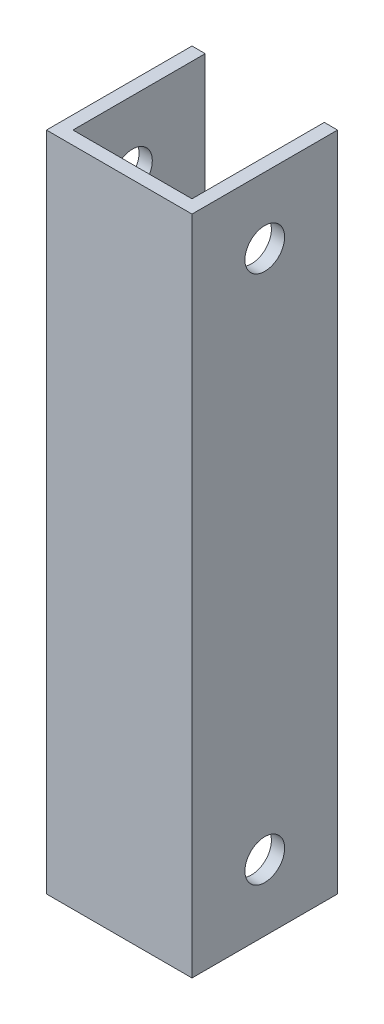
ISO-10303-21;
HEADER;
FILE_DESCRIPTION(('STEP AP214'),'2;1');
FILE_NAME('part.step','',(''),(''),'','','');
FILE_SCHEMA(('AUTOMOTIVE_DESIGN { 1 0 10303 214 1 1 1 1 }'));
ENDSEC;
DATA;
#1=APPLICATION_CONTEXT('core data for automotive mechanical design processes');
#2=APPLICATION_PROTOCOL_DEFINITION('international standard','automotive_design',2000,#1);
#3=PRODUCT_CONTEXT('',#1,'mechanical');
#4=PRODUCT('Part','Part','',(#3));
#5=PRODUCT_RELATED_PRODUCT_CATEGORY('part','',(#4));
#6=PRODUCT_DEFINITION_FORMATION('','',#4);
#7=PRODUCT_DEFINITION_CONTEXT('part definition',#1,'design');
#8=PRODUCT_DEFINITION('design','',#6,#7);
#9=PRODUCT_DEFINITION_SHAPE('','',#8);
#10=(LENGTH_UNIT() NAMED_UNIT(*) SI_UNIT(.MILLI.,.METRE.));
#11=(NAMED_UNIT(*) PLANE_ANGLE_UNIT() SI_UNIT($,.RADIAN.));
#12=(NAMED_UNIT(*) SI_UNIT($,.STERADIAN.) SOLID_ANGLE_UNIT());
#13=UNCERTAINTY_MEASURE_WITH_UNIT(LENGTH_MEASURE(1.E-05),#10,'distance_accuracy_value','');
#14=(GEOMETRIC_REPRESENTATION_CONTEXT(3) GLOBAL_UNCERTAINTY_ASSIGNED_CONTEXT((#13)) GLOBAL_UNIT_ASSIGNED_CONTEXT((#10,
#11,#12)) REPRESENTATION_CONTEXT('',''));
#15=CARTESIAN_POINT('',(0.,0.,0.));
#16=DIRECTION('',(0.,0.,1.));
#17=DIRECTION('',(1.,0.,0.));
#18=AXIS2_PLACEMENT_3D('',#15,#16,#17);
#19=CARTESIAN_POINT('',(11.,100.,-11.));
#20=DIRECTION('',(-1.,0.,0.));
#21=DIRECTION('',(0.,0.,1.));
#22=AXIS2_PLACEMENT_3D('',#19,#20,#21);
#23=PLANE('',#22);
#24=CARTESIAN_POINT('',(11.,90.,0.));
#25=DIRECTION('',(1.,0.,0.));
#26=DIRECTION('',(0.,0.,-1.));
#27=AXIS2_PLACEMENT_3D('',#24,#25,#26);
#28=CIRCLE('',#27,3.);
#29=CARTESIAN_POINT('',(11.,90.,-3.));
#30=VERTEX_POINT('',#29);
#31=EDGE_CURVE('E228',#30,#30,#28,.T.);
#32=ORIENTED_EDGE('',*,*,#31,.F.);
#33=EDGE_LOOP('',(#32));
#34=FACE_BOUND('',#33,.T.);
#35=CARTESIAN_POINT('',(11.,10.,0.));
#36=DIRECTION('',(1.,0.,0.));
#37=DIRECTION('',(0.,0.,-1.));
#38=AXIS2_PLACEMENT_3D('',#35,#36,#37);
#39=CIRCLE('',#38,3.);
#40=CARTESIAN_POINT('',(11.,10.,-3.));
#41=VERTEX_POINT('',#40);
#42=EDGE_CURVE('E215',#41,#41,#39,.T.);
#43=ORIENTED_EDGE('',*,*,#42,.F.);
#44=EDGE_LOOP('',(#43));
#45=FACE_BOUND('',#44,.T.);
#46=DIRECTION('',(0.,0.,-1.));
#47=VECTOR('',#46,1.);
#48=CARTESIAN_POINT('',(11.,0.,-11.));
#49=LINE('',#48,#47);
#50=CARTESIAN_POINT('',(11.,0.,11.));
#51=VERTEX_POINT('',#50);
#52=CARTESIAN_POINT('',(11.,0.,-11.));
#53=VERTEX_POINT('',#52);
#54=EDGE_CURVE('E140',#51,#53,#49,.T.);
#55=ORIENTED_EDGE('',*,*,#54,.T.);
#56=DIRECTION('',(0.,-1.,0.));
#57=VECTOR('',#56,1.);
#58=CARTESIAN_POINT('',(11.,100.,-11.));
#59=LINE('',#58,#57);
#60=CARTESIAN_POINT('',(11.,100.,-11.));
#61=VERTEX_POINT('',#60);
#62=EDGE_CURVE('E11',#61,#53,#59,.T.);
#63=ORIENTED_EDGE('',*,*,#62,.F.);
#64=DIRECTION('',(0.,0.,-1.));
#65=VECTOR('',#64,1.);
#66=CARTESIAN_POINT('',(11.,100.,-11.));
#67=LINE('',#66,#65);
#68=CARTESIAN_POINT('',(11.,100.,11.));
#69=VERTEX_POINT('',#68);
#70=EDGE_CURVE('E163',#69,#61,#67,.T.);
#71=ORIENTED_EDGE('',*,*,#70,.F.);
#72=DIRECTION('',(0.,-1.,0.));
#73=VECTOR('',#72,1.);
#74=CARTESIAN_POINT('',(11.,100.,11.));
#75=LINE('',#74,#73);
#76=EDGE_CURVE('E136',#69,#51,#75,.T.);
#77=ORIENTED_EDGE('',*,*,#76,.T.);
#78=EDGE_LOOP('',(#55,#63,#71,#77));
#79=FACE_BOUND('',#78,.T.);
#80=ADVANCED_FACE('F38',(#34,#45,#79),#23,.F.);
#81=CARTESIAN_POINT('',(9.,100.,-11.));
#82=DIRECTION('',(0.,0.,1.));
#83=DIRECTION('',(1.,0.,0.));
#84=AXIS2_PLACEMENT_3D('',#81,#82,#83);
#85=PLANE('',#84);
#86=DIRECTION('',(-1.,0.,0.));
#87=VECTOR('',#86,1.);
#88=CARTESIAN_POINT('',(9.,0.,-11.));
#89=LINE('',#88,#87);
#90=CARTESIAN_POINT('',(9.,0.,-11.));
#91=VERTEX_POINT('',#90);
#92=EDGE_CURVE('E144',#53,#91,#89,.T.);
#93=ORIENTED_EDGE('',*,*,#92,.T.);
#94=DIRECTION('',(0.,-1.,0.));
#95=VECTOR('',#94,1.);
#96=CARTESIAN_POINT('',(9.,100.,-11.));
#97=LINE('',#96,#95);
#98=CARTESIAN_POINT('',(9.,100.,-11.));
#99=VERTEX_POINT('',#98);
#100=EDGE_CURVE('E48',#99,#91,#97,.T.);
#101=ORIENTED_EDGE('',*,*,#100,.F.);
#102=DIRECTION('',(-1.,0.,0.));
#103=VECTOR('',#102,1.);
#104=CARTESIAN_POINT('',(9.,100.,-11.));
#105=LINE('',#104,#103);
#106=EDGE_CURVE('E99',#61,#99,#105,.T.);
#107=ORIENTED_EDGE('',*,*,#106,.F.);
#108=ORIENTED_EDGE('',*,*,#62,.T.);
#109=EDGE_LOOP('',(#93,#101,#107,#108));
#110=FACE_BOUND('',#109,.T.);
#111=ADVANCED_FACE('F264',(#110),#85,.F.);
#112=CARTESIAN_POINT('',(9.,100.,9.));
#113=DIRECTION('',(1.,0.,0.));
#114=DIRECTION('',(0.,0.,-1.));
#115=AXIS2_PLACEMENT_3D('',#112,#113,#114);
#116=PLANE('',#115);
#117=CARTESIAN_POINT('',(9.,90.,0.));
#118=DIRECTION('',(1.,0.,0.));
#119=DIRECTION('',(0.,0.,-1.));
#120=AXIS2_PLACEMENT_3D('',#117,#118,#119);
#121=CIRCLE('',#120,3.);
#122=CARTESIAN_POINT('',(9.,90.,-3.));
#123=VERTEX_POINT('',#122);
#124=EDGE_CURVE('E219',#123,#123,#121,.T.);
#125=ORIENTED_EDGE('',*,*,#124,.T.);
#126=EDGE_LOOP('',(#125));
#127=FACE_BOUND('',#126,.T.);
#128=CARTESIAN_POINT('',(8.99999999999999,10.,0.));
#129=DIRECTION('',(1.,0.,0.));
#130=DIRECTION('',(0.,0.,-1.));
#131=AXIS2_PLACEMENT_3D('',#128,#129,#130);
#132=CIRCLE('',#131,3.);
#133=CARTESIAN_POINT('',(8.99999999999999,10.,-3.));
#134=VERTEX_POINT('',#133);
#135=EDGE_CURVE('E145',#134,#134,#132,.T.);
#136=ORIENTED_EDGE('',*,*,#135,.T.);
#137=EDGE_LOOP('',(#136));
#138=FACE_BOUND('',#137,.T.);
#139=DIRECTION('',(0.,0.,1.));
#140=VECTOR('',#139,1.);
#141=CARTESIAN_POINT('',(9.,0.,9.));
#142=LINE('',#141,#140);
#143=CARTESIAN_POINT('',(9.,0.,9.));
#144=VERTEX_POINT('',#143);
#145=EDGE_CURVE('E148',#91,#144,#142,.T.);
#146=ORIENTED_EDGE('',*,*,#145,.T.);
#147=DIRECTION('',(0.,-1.,0.));
#148=VECTOR('',#147,1.);
#149=CARTESIAN_POINT('',(9.,100.,9.));
#150=LINE('',#149,#148);
#151=CARTESIAN_POINT('',(9.,100.,9.));
#152=VERTEX_POINT('',#151);
#153=EDGE_CURVE('E174',#152,#144,#150,.T.);
#154=ORIENTED_EDGE('',*,*,#153,.F.);
#155=DIRECTION('',(0.,0.,1.));
#156=VECTOR('',#155,1.);
#157=CARTESIAN_POINT('',(9.,100.,9.));
#158=LINE('',#157,#156);
#159=EDGE_CURVE('E185',#99,#152,#158,.T.);
#160=ORIENTED_EDGE('',*,*,#159,.F.);
#161=ORIENTED_EDGE('',*,*,#100,.T.);
#162=EDGE_LOOP('',(#146,#154,#160,#161));
#163=FACE_BOUND('',#162,.T.);
#164=ADVANCED_FACE('F183',(#127,#138,#163),#116,.F.);
#165=CARTESIAN_POINT('',(-9.,100.,9.));
#166=DIRECTION('',(0.,0.,1.));
#167=DIRECTION('',(1.,0.,0.));
#168=AXIS2_PLACEMENT_3D('',#165,#166,#167);
#169=PLANE('',#168);
#170=DIRECTION('',(-1.,0.,0.));
#171=VECTOR('',#170,1.);
#172=CARTESIAN_POINT('',(-9.,0.,9.));
#173=LINE('',#172,#171);
#174=CARTESIAN_POINT('',(-9.,0.,9.));
#175=VERTEX_POINT('',#174);
#176=EDGE_CURVE('E151',#144,#175,#173,.T.);
#177=ORIENTED_EDGE('',*,*,#176,.T.);
#178=DIRECTION('',(0.,-1.,0.));
#179=VECTOR('',#178,1.);
#180=CARTESIAN_POINT('',(-9.,100.,9.));
#181=LINE('',#180,#179);
#182=CARTESIAN_POINT('',(-9.,100.,9.));
#183=VERTEX_POINT('',#182);
#184=EDGE_CURVE('E170',#183,#175,#181,.T.);
#185=ORIENTED_EDGE('',*,*,#184,.F.);
#186=DIRECTION('',(-1.,0.,0.));
#187=VECTOR('',#186,1.);
#188=CARTESIAN_POINT('',(-9.,100.,9.));
#189=LINE('',#188,#187);
#190=EDGE_CURVE('E198',#152,#183,#189,.T.);
#191=ORIENTED_EDGE('',*,*,#190,.F.);
#192=ORIENTED_EDGE('',*,*,#153,.T.);
#193=EDGE_LOOP('',(#177,#185,#191,#192));
#194=FACE_BOUND('',#193,.T.);
#195=ADVANCED_FACE('F193',(#194),#169,.F.);
#196=CARTESIAN_POINT('',(-9.,100.,-11.));
#197=DIRECTION('',(-1.,0.,0.));
#198=DIRECTION('',(0.,0.,1.));
#199=AXIS2_PLACEMENT_3D('',#196,#197,#198);
#200=PLANE('',#199);
#201=CARTESIAN_POINT('',(-9.,90.,0.));
#202=DIRECTION('',(-1.,0.,0.));
#203=DIRECTION('',(0.,0.,1.));
#204=AXIS2_PLACEMENT_3D('',#201,#202,#203);
#205=CIRCLE('',#204,3.);
#206=CARTESIAN_POINT('',(-9.,90.,3.));
#207=VERTEX_POINT('',#206);
#208=EDGE_CURVE('E223',#207,#207,#205,.T.);
#209=ORIENTED_EDGE('',*,*,#208,.T.);
#210=EDGE_LOOP('',(#209));
#211=FACE_BOUND('',#210,.T.);
#212=CARTESIAN_POINT('',(-8.99999999999999,10.,0.));
#213=DIRECTION('',(-1.,0.,0.));
#214=DIRECTION('',(0.,0.,1.));
#215=AXIS2_PLACEMENT_3D('',#212,#213,#214);
#216=CIRCLE('',#215,3.);
#217=CARTESIAN_POINT('',(-8.99999999999999,10.,3.));
#218=VERTEX_POINT('',#217);
#219=EDGE_CURVE('E211',#218,#218,#216,.T.);
#220=ORIENTED_EDGE('',*,*,#219,.T.);
#221=EDGE_LOOP('',(#220));
#222=FACE_BOUND('',#221,.T.);
#223=DIRECTION('',(0.,0.,-1.));
#224=VECTOR('',#223,1.);
#225=CARTESIAN_POINT('',(-9.,0.,-11.));
#226=LINE('',#225,#224);
#227=CARTESIAN_POINT('',(-9.,0.,-11.));
#228=VERTEX_POINT('',#227);
#229=EDGE_CURVE('E154',#175,#228,#226,.T.);
#230=ORIENTED_EDGE('',*,*,#229,.T.);
#231=DIRECTION('',(0.,-1.,0.));
#232=VECTOR('',#231,1.);
#233=CARTESIAN_POINT('',(-9.,100.,-11.));
#234=LINE('',#233,#232);
#235=CARTESIAN_POINT('',(-9.,100.,-11.));
#236=VERTEX_POINT('',#235);
#237=EDGE_CURVE('E129',#236,#228,#234,.T.);
#238=ORIENTED_EDGE('',*,*,#237,.F.);
#239=DIRECTION('',(0.,0.,-1.));
#240=VECTOR('',#239,1.);
#241=CARTESIAN_POINT('',(-9.,100.,-11.));
#242=LINE('',#241,#240);
#243=EDGE_CURVE('E118',#183,#236,#242,.T.);
#244=ORIENTED_EDGE('',*,*,#243,.F.);
#245=ORIENTED_EDGE('',*,*,#184,.T.);
#246=EDGE_LOOP('',(#230,#238,#244,#245));
#247=FACE_BOUND('',#246,.T.);
#248=ADVANCED_FACE('F196',(#211,#222,#247),#200,.F.);
#249=CARTESIAN_POINT('',(-11.,100.,-11.));
#250=DIRECTION('',(0.,0.,1.));
#251=DIRECTION('',(1.,0.,0.));
#252=AXIS2_PLACEMENT_3D('',#249,#250,#251);
#253=PLANE('',#252);
#254=DIRECTION('',(-1.,0.,0.));
#255=VECTOR('',#254,1.);
#256=CARTESIAN_POINT('',(-11.,0.,-11.));
#257=LINE('',#256,#255);
#258=CARTESIAN_POINT('',(-11.,0.,-11.));
#259=VERTEX_POINT('',#258);
#260=EDGE_CURVE('E127',#228,#259,#257,.T.);
#261=ORIENTED_EDGE('',*,*,#260,.T.);
#262=DIRECTION('',(0.,-1.,0.));
#263=VECTOR('',#262,1.);
#264=CARTESIAN_POINT('',(-11.,100.,-11.));
#265=LINE('',#264,#263);
#266=CARTESIAN_POINT('',(-11.,100.,-11.));
#267=VERTEX_POINT('',#266);
#268=EDGE_CURVE('E124',#267,#259,#265,.T.);
#269=ORIENTED_EDGE('',*,*,#268,.F.);
#270=DIRECTION('',(-1.,0.,0.));
#271=VECTOR('',#270,1.);
#272=CARTESIAN_POINT('',(-11.,100.,-11.));
#273=LINE('',#272,#271);
#274=EDGE_CURVE('E112',#236,#267,#273,.T.);
#275=ORIENTED_EDGE('',*,*,#274,.F.);
#276=ORIENTED_EDGE('',*,*,#237,.T.);
#277=EDGE_LOOP('',(#261,#269,#275,#276));
#278=FACE_BOUND('',#277,.T.);
#279=ADVANCED_FACE('F125',(#278),#253,.F.);
#280=CARTESIAN_POINT('',(-11.,100.,-11.));
#281=DIRECTION('',(1.,0.,0.));
#282=DIRECTION('',(0.,0.,-1.));
#283=AXIS2_PLACEMENT_3D('',#280,#281,#282);
#284=PLANE('',#283);
#285=CARTESIAN_POINT('',(-11.,90.,0.));
#286=DIRECTION('',(1.,0.,0.));
#287=DIRECTION('',(0.,0.,-1.));
#288=AXIS2_PLACEMENT_3D('',#285,#286,#287);
#289=CIRCLE('',#288,3.);
#290=CARTESIAN_POINT('',(-11.,90.,-3.));
#291=VERTEX_POINT('',#290);
#292=EDGE_CURVE('E227',#291,#291,#289,.T.);
#293=ORIENTED_EDGE('',*,*,#292,.T.);
#294=EDGE_LOOP('',(#293));
#295=FACE_BOUND('',#294,.T.);
#296=CARTESIAN_POINT('',(-11.,10.,0.));
#297=DIRECTION('',(1.,0.,0.));
#298=DIRECTION('',(0.,0.,-1.));
#299=AXIS2_PLACEMENT_3D('',#296,#297,#298);
#300=CIRCLE('',#299,3.);
#301=CARTESIAN_POINT('',(-11.,10.,-3.));
#302=VERTEX_POINT('',#301);
#303=EDGE_CURVE('E41',#302,#302,#300,.T.);
#304=ORIENTED_EDGE('',*,*,#303,.T.);
#305=EDGE_LOOP('',(#304));
#306=FACE_BOUND('',#305,.T.);
#307=DIRECTION('',(0.,0.,1.));
#308=VECTOR('',#307,1.);
#309=CARTESIAN_POINT('',(-11.,0.,-11.));
#310=LINE('',#309,#308);
#311=CARTESIAN_POINT('',(-11.,0.,11.));
#312=VERTEX_POINT('',#311);
#313=EDGE_CURVE('E85',#259,#312,#310,.T.);
#314=ORIENTED_EDGE('',*,*,#313,.T.);
#315=DIRECTION('',(0.,-1.,0.));
#316=VECTOR('',#315,1.);
#317=CARTESIAN_POINT('',(-11.,100.,11.));
#318=LINE('',#317,#316);
#319=CARTESIAN_POINT('',(-11.,100.,11.));
#320=VERTEX_POINT('',#319);
#321=EDGE_CURVE('E130',#320,#312,#318,.T.);
#322=ORIENTED_EDGE('',*,*,#321,.F.);
#323=DIRECTION('',(0.,0.,1.));
#324=VECTOR('',#323,1.);
#325=CARTESIAN_POINT('',(-11.,100.,-11.));
#326=LINE('',#325,#324);
#327=EDGE_CURVE('E116',#267,#320,#326,.T.);
#328=ORIENTED_EDGE('',*,*,#327,.F.);
#329=ORIENTED_EDGE('',*,*,#268,.T.);
#330=EDGE_LOOP('',(#314,#322,#328,#329));
#331=FACE_BOUND('',#330,.T.);
#332=ADVANCED_FACE('F132',(#295,#306,#331),#284,.F.);
#333=CARTESIAN_POINT('',(-11.,100.,11.));
#334=DIRECTION('',(0.,0.,-1.));
#335=DIRECTION('',(-1.,0.,0.));
#336=AXIS2_PLACEMENT_3D('',#333,#334,#335);
#337=PLANE('',#336);
#338=DIRECTION('',(1.,0.,0.));
#339=VECTOR('',#338,1.);
#340=CARTESIAN_POINT('',(-11.,0.,11.));
#341=LINE('',#340,#339);
#342=EDGE_CURVE('E91',#312,#51,#341,.T.);
#343=ORIENTED_EDGE('',*,*,#342,.T.);
#344=ORIENTED_EDGE('',*,*,#76,.F.);
#345=DIRECTION('',(1.,0.,0.));
#346=VECTOR('',#345,1.);
#347=CARTESIAN_POINT('',(-11.,100.,11.));
#348=LINE('',#347,#346);
#349=EDGE_CURVE('E56',#320,#69,#348,.T.);
#350=ORIENTED_EDGE('',*,*,#349,.F.);
#351=ORIENTED_EDGE('',*,*,#321,.T.);
#352=EDGE_LOOP('',(#343,#344,#350,#351));
#353=FACE_BOUND('',#352,.T.);
#354=ADVANCED_FACE('F277',(#353),#337,.F.);
#355=CARTESIAN_POINT('',(0.,100.,0.));
#356=DIRECTION('',(0.,1.,0.));
#357=DIRECTION('',(0.,0.,1.));
#358=AXIS2_PLACEMENT_3D('',#355,#356,#357);
#359=PLANE('',#358);
#360=ORIENTED_EDGE('',*,*,#70,.T.);
#361=ORIENTED_EDGE('',*,*,#106,.T.);
#362=ORIENTED_EDGE('',*,*,#159,.T.);
#363=ORIENTED_EDGE('',*,*,#190,.T.);
#364=ORIENTED_EDGE('',*,*,#243,.T.);
#365=ORIENTED_EDGE('',*,*,#274,.T.);
#366=ORIENTED_EDGE('',*,*,#327,.T.);
#367=ORIENTED_EDGE('',*,*,#349,.T.);
#368=EDGE_LOOP('',(#360,#361,#362,#363,#364,#365,#366,#367));
#369=FACE_BOUND('',#368,.T.);
#370=ADVANCED_FACE('F114',(#369),#359,.T.);
#371=CARTESIAN_POINT('',(0.,0.,0.));
#372=DIRECTION('',(0.,1.,0.));
#373=DIRECTION('',(0.,0.,1.));
#374=AXIS2_PLACEMENT_3D('',#371,#372,#373);
#375=PLANE('',#374);
#376=ORIENTED_EDGE('',*,*,#54,.F.);
#377=ORIENTED_EDGE('',*,*,#342,.F.);
#378=ORIENTED_EDGE('',*,*,#313,.F.);
#379=ORIENTED_EDGE('',*,*,#260,.F.);
#380=ORIENTED_EDGE('',*,*,#229,.F.);
#381=ORIENTED_EDGE('',*,*,#176,.F.);
#382=ORIENTED_EDGE('',*,*,#145,.F.);
#383=ORIENTED_EDGE('',*,*,#92,.F.);
#384=EDGE_LOOP('',(#376,#377,#378,#379,#380,#381,#382,#383));
#385=FACE_BOUND('',#384,.T.);
#386=ADVANCED_FACE('F189',(#385),#375,.F.);
#387=CARTESIAN_POINT('',(-89.,10.,0.));
#388=DIRECTION('',(1.,0.,0.));
#389=DIRECTION('',(0.,0.,-1.));
#390=AXIS2_PLACEMENT_3D('',#387,#388,#389);
#391=CYLINDRICAL_SURFACE('',#390,3.);
#392=ORIENTED_EDGE('',*,*,#303,.F.);
#393=EDGE_LOOP('',(#392));
#394=FACE_BOUND('',#393,.T.);
#395=ORIENTED_EDGE('',*,*,#219,.F.);
#396=EDGE_LOOP('',(#395));
#397=FACE_BOUND('',#396,.T.);
#398=ADVANCED_FACE('F251',(#394,#397),#391,.F.);
#399=ORIENTED_EDGE('',*,*,#42,.T.);
#400=EDGE_LOOP('',(#399));
#401=FACE_BOUND('',#400,.T.);
#402=ORIENTED_EDGE('',*,*,#135,.F.);
#403=EDGE_LOOP('',(#402));
#404=FACE_BOUND('',#403,.T.);
#405=ADVANCED_FACE('F242',(#401,#404),#391,.F.);
#406=CARTESIAN_POINT('',(-11.,90.,0.));
#407=DIRECTION('',(1.,0.,0.));
#408=DIRECTION('',(0.,0.,-1.));
#409=AXIS2_PLACEMENT_3D('',#406,#407,#408);
#410=CYLINDRICAL_SURFACE('',#409,3.);
#411=ORIENTED_EDGE('',*,*,#292,.F.);
#412=EDGE_LOOP('',(#411));
#413=FACE_BOUND('',#412,.T.);
#414=ORIENTED_EDGE('',*,*,#208,.F.);
#415=EDGE_LOOP('',(#414));
#416=FACE_BOUND('',#415,.T.);
#417=ADVANCED_FACE('F238',(#413,#416),#410,.F.);
#418=ORIENTED_EDGE('',*,*,#31,.T.);
#419=EDGE_LOOP('',(#418));
#420=FACE_BOUND('',#419,.T.);
#421=ORIENTED_EDGE('',*,*,#124,.F.);
#422=EDGE_LOOP('',(#421));
#423=FACE_BOUND('',#422,.T.);
#424=ADVANCED_FACE('F241',(#420,#423),#410,.F.);
#425=CLOSED_SHELL('',(#80,#111,#164,#195,#248,#279,#332,#354,#370,#386,#398,#405,#417,#424));
#426=MANIFOLD_SOLID_BREP('B2',#425);
#427=ADVANCED_BREP_SHAPE_REPRESENTATION('',(#18,#426),#14);
#428=SHAPE_DEFINITION_REPRESENTATION(#9,#427);
ENDSEC;
END-ISO-10303-21;
